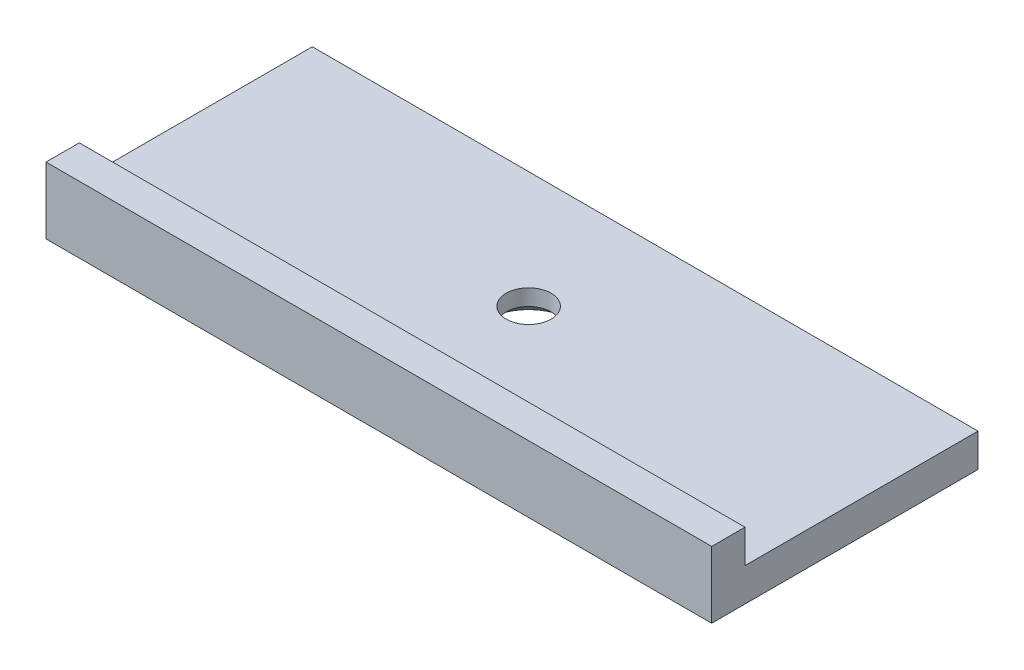
ISO-10303-21;
HEADER;
FILE_DESCRIPTION(('STEP AP214'),'2;1');
FILE_NAME('part.step','',(''),(''),'','','');
FILE_SCHEMA(('AUTOMOTIVE_DESIGN { 1 0 10303 214 1 1 1 1 }'));
ENDSEC;
DATA;
#1=APPLICATION_CONTEXT('core data for automotive mechanical design processes');
#2=APPLICATION_PROTOCOL_DEFINITION('international standard','automotive_design',2000,#1);
#3=PRODUCT_CONTEXT('',#1,'mechanical');
#4=PRODUCT('Part','Part','',(#3));
#5=PRODUCT_RELATED_PRODUCT_CATEGORY('part','',(#4));
#6=PRODUCT_DEFINITION_FORMATION('','',#4);
#7=PRODUCT_DEFINITION_CONTEXT('part definition',#1,'design');
#8=PRODUCT_DEFINITION('design','',#6,#7);
#9=PRODUCT_DEFINITION_SHAPE('','',#8);
#10=(LENGTH_UNIT() NAMED_UNIT(*) SI_UNIT(.MILLI.,.METRE.));
#11=(NAMED_UNIT(*) PLANE_ANGLE_UNIT() SI_UNIT($,.RADIAN.));
#12=(NAMED_UNIT(*) SI_UNIT($,.STERADIAN.) SOLID_ANGLE_UNIT());
#13=UNCERTAINTY_MEASURE_WITH_UNIT(LENGTH_MEASURE(1.E-05),#10,'distance_accuracy_value','');
#14=(GEOMETRIC_REPRESENTATION_CONTEXT(3) GLOBAL_UNCERTAINTY_ASSIGNED_CONTEXT((#13)) GLOBAL_UNIT_ASSIGNED_CONTEXT((#10,
#11,#12)) REPRESENTATION_CONTEXT('',''));
#15=CARTESIAN_POINT('',(0.,0.,0.));
#16=DIRECTION('',(0.,0.,1.));
#17=DIRECTION('',(1.,0.,0.));
#18=AXIS2_PLACEMENT_3D('',#15,#16,#17);
#19=CARTESIAN_POINT('',(50.,5.,17.5));
#20=DIRECTION('',(-1.,0.,0.));
#21=DIRECTION('',(0.,0.,1.));
#22=AXIS2_PLACEMENT_3D('',#19,#20,#21);
#23=PLANE('',#22);
#24=DIRECTION('',(0.,0.,-1.));
#25=VECTOR('',#24,1.);
#26=CARTESIAN_POINT('',(50.,0.,17.5));
#27=LINE('',#26,#25);
#28=CARTESIAN_POINT('',(50.,0.,22.5));
#29=VERTEX_POINT('',#28);
#30=CARTESIAN_POINT('',(50.,0.,-17.5));
#31=VERTEX_POINT('',#30);
#32=EDGE_CURVE('E100',#29,#31,#27,.T.);
#33=ORIENTED_EDGE('',*,*,#32,.T.);
#34=DIRECTION('',(0.,-1.,0.));
#35=VECTOR('',#34,1.);
#36=CARTESIAN_POINT('',(50.,5.,-17.5));
#37=LINE('',#36,#35);
#38=CARTESIAN_POINT('',(50.,5.,-17.5));
#39=VERTEX_POINT('',#38);
#40=EDGE_CURVE('E11',#39,#31,#37,.T.);
#41=ORIENTED_EDGE('',*,*,#40,.F.);
#42=DIRECTION('',(0.,0.,-1.));
#43=VECTOR('',#42,1.);
#44=CARTESIAN_POINT('',(50.,5.,17.5));
#45=LINE('',#44,#43);
#46=CARTESIAN_POINT('',(50.,5.,17.5));
#47=VERTEX_POINT('',#46);
#48=EDGE_CURVE('E92',#47,#39,#45,.T.);
#49=ORIENTED_EDGE('',*,*,#48,.F.);
#50=DIRECTION('',(0.,-1.,0.));
#51=VECTOR('',#50,1.);
#52=CARTESIAN_POINT('',(50.,10.,17.5));
#53=LINE('',#52,#51);
#54=CARTESIAN_POINT('',(50.,10.,17.5));
#55=VERTEX_POINT('',#54);
#56=EDGE_CURVE('E54',#55,#47,#53,.T.);
#57=ORIENTED_EDGE('',*,*,#56,.F.);
#58=DIRECTION('',(0.,0.,-1.));
#59=VECTOR('',#58,1.);
#60=CARTESIAN_POINT('',(50.,10.,17.5));
#61=LINE('',#60,#59);
#62=CARTESIAN_POINT('',(50.,10.,22.5));
#63=VERTEX_POINT('',#62);
#64=EDGE_CURVE('E127',#63,#55,#61,.T.);
#65=ORIENTED_EDGE('',*,*,#64,.F.);
#66=DIRECTION('',(0.,-1.,0.));
#67=VECTOR('',#66,1.);
#68=CARTESIAN_POINT('',(50.,10.,22.5));
#69=LINE('',#68,#67);
#70=EDGE_CURVE('E103',#63,#29,#69,.T.);
#71=ORIENTED_EDGE('',*,*,#70,.T.);
#72=EDGE_LOOP('',(#33,#41,#49,#57,#65,#71));
#73=FACE_BOUND('',#72,.T.);
#74=ADVANCED_FACE('F37',(#73),#23,.F.);
#75=CARTESIAN_POINT('',(-50.,5.,-17.5));
#76=DIRECTION('',(0.,0.,1.));
#77=DIRECTION('',(1.,0.,0.));
#78=AXIS2_PLACEMENT_3D('',#75,#76,#77);
#79=PLANE('',#78);
#80=DIRECTION('',(-1.,0.,0.));
#81=VECTOR('',#80,1.);
#82=CARTESIAN_POINT('',(-50.,0.,-17.5));
#83=LINE('',#82,#81);
#84=CARTESIAN_POINT('',(-50.,0.,-17.5));
#85=VERTEX_POINT('',#84);
#86=EDGE_CURVE('E67',#31,#85,#83,.T.);
#87=ORIENTED_EDGE('',*,*,#86,.T.);
#88=DIRECTION('',(0.,-1.,0.));
#89=VECTOR('',#88,1.);
#90=CARTESIAN_POINT('',(-50.,5.,-17.5));
#91=LINE('',#90,#89);
#92=CARTESIAN_POINT('',(-50.,5.,-17.5));
#93=VERTEX_POINT('',#92);
#94=EDGE_CURVE('E46',#93,#85,#91,.T.);
#95=ORIENTED_EDGE('',*,*,#94,.F.);
#96=DIRECTION('',(-1.,0.,0.));
#97=VECTOR('',#96,1.);
#98=CARTESIAN_POINT('',(-50.,5.,-17.5));
#99=LINE('',#98,#97);
#100=EDGE_CURVE('E82',#39,#93,#99,.T.);
#101=ORIENTED_EDGE('',*,*,#100,.F.);
#102=ORIENTED_EDGE('',*,*,#40,.T.);
#103=EDGE_LOOP('',(#87,#95,#101,#102));
#104=FACE_BOUND('',#103,.T.);
#105=ADVANCED_FACE('F84',(#104),#79,.F.);
#106=CARTESIAN_POINT('',(-50.,5.,17.5));
#107=DIRECTION('',(1.,0.,0.));
#108=DIRECTION('',(0.,0.,-1.));
#109=AXIS2_PLACEMENT_3D('',#106,#107,#108);
#110=PLANE('',#109);
#111=DIRECTION('',(0.,0.,1.));
#112=VECTOR('',#111,1.);
#113=CARTESIAN_POINT('',(-50.,0.,17.5));
#114=LINE('',#113,#112);
#115=CARTESIAN_POINT('',(-50.,0.,22.5));
#116=VERTEX_POINT('',#115);
#117=EDGE_CURVE('E97',#85,#116,#114,.T.);
#118=ORIENTED_EDGE('',*,*,#117,.T.);
#119=DIRECTION('',(0.,-1.,0.));
#120=VECTOR('',#119,1.);
#121=CARTESIAN_POINT('',(-50.,10.,22.5));
#122=LINE('',#121,#120);
#123=CARTESIAN_POINT('',(-50.,10.,22.5));
#124=VERTEX_POINT('',#123);
#125=EDGE_CURVE('E106',#124,#116,#122,.T.);
#126=ORIENTED_EDGE('',*,*,#125,.F.);
#127=DIRECTION('',(0.,0.,1.));
#128=VECTOR('',#127,1.);
#129=CARTESIAN_POINT('',(-50.,10.,17.5));
#130=LINE('',#129,#128);
#131=CARTESIAN_POINT('',(-50.,10.,17.5));
#132=VERTEX_POINT('',#131);
#133=EDGE_CURVE('E125',#132,#124,#130,.T.);
#134=ORIENTED_EDGE('',*,*,#133,.F.);
#135=DIRECTION('',(0.,-1.,0.));
#136=VECTOR('',#135,1.);
#137=CARTESIAN_POINT('',(-50.,10.,17.5));
#138=LINE('',#137,#136);
#139=CARTESIAN_POINT('',(-50.,5.,17.5));
#140=VERTEX_POINT('',#139);
#141=EDGE_CURVE('E120',#132,#140,#138,.T.);
#142=ORIENTED_EDGE('',*,*,#141,.T.);
#143=DIRECTION('',(0.,0.,1.));
#144=VECTOR('',#143,1.);
#145=CARTESIAN_POINT('',(-50.,5.,17.5));
#146=LINE('',#145,#144);
#147=EDGE_CURVE('E91',#93,#140,#146,.T.);
#148=ORIENTED_EDGE('',*,*,#147,.F.);
#149=ORIENTED_EDGE('',*,*,#94,.T.);
#150=EDGE_LOOP('',(#118,#126,#134,#142,#148,#149));
#151=FACE_BOUND('',#150,.T.);
#152=ADVANCED_FACE('F155',(#151),#110,.F.);
#153=CARTESIAN_POINT('',(0.,5.,0.));
#154=DIRECTION('',(0.,-1.,0.));
#155=DIRECTION('',(0.,0.,-1.));
#156=AXIS2_PLACEMENT_3D('',#153,#154,#155);
#157=PLANE('',#156);
#158=CARTESIAN_POINT('',(0.,5.,0.));
#159=DIRECTION('',(0.,-1.,0.));
#160=DIRECTION('',(0.,0.,-1.));
#161=AXIS2_PLACEMENT_3D('',#158,#159,#160);
#162=CIRCLE('',#161,3.3782);
#163=CARTESIAN_POINT('',(0.,5.,-3.3782));
#164=VERTEX_POINT('',#163);
#165=EDGE_CURVE('E40',#164,#164,#162,.T.);
#166=ORIENTED_EDGE('',*,*,#165,.T.);
#167=EDGE_LOOP('',(#166));
#168=FACE_BOUND('',#167,.T.);
#169=ORIENTED_EDGE('',*,*,#48,.T.);
#170=ORIENTED_EDGE('',*,*,#100,.T.);
#171=ORIENTED_EDGE('',*,*,#147,.T.);
#172=DIRECTION('',(1.,0.,0.));
#173=VECTOR('',#172,1.);
#174=CARTESIAN_POINT('',(-50.,5.,17.5));
#175=LINE('',#174,#173);
#176=EDGE_CURVE('E71',#140,#47,#175,.T.);
#177=ORIENTED_EDGE('',*,*,#176,.T.);
#178=EDGE_LOOP('',(#169,#170,#171,#177));
#179=FACE_BOUND('',#178,.T.);
#180=ADVANCED_FACE('F95',(#168,#179),#157,.F.);
#181=CARTESIAN_POINT('',(0.,0.,0.));
#182=DIRECTION('',(0.,-1.,0.));
#183=DIRECTION('',(0.,0.,-1.));
#184=AXIS2_PLACEMENT_3D('',#181,#182,#183);
#185=PLANE('',#184);
#186=CARTESIAN_POINT('',(0.,0.,0.));
#187=DIRECTION('',(0.,-1.,0.));
#188=DIRECTION('',(0.,0.,-1.));
#189=AXIS2_PLACEMENT_3D('',#186,#187,#188);
#190=CIRCLE('',#189,6.4389);
#191=CARTESIAN_POINT('',(0.,0.,-6.4389));
#192=VERTEX_POINT('',#191);
#193=EDGE_CURVE('E138',#192,#192,#190,.T.);
#194=ORIENTED_EDGE('',*,*,#193,.F.);
#195=EDGE_LOOP('',(#194));
#196=FACE_BOUND('',#195,.T.);
#197=ORIENTED_EDGE('',*,*,#32,.F.);
#198=DIRECTION('',(1.,0.,0.));
#199=VECTOR('',#198,1.);
#200=CARTESIAN_POINT('',(50.,0.,22.5));
#201=LINE('',#200,#199);
#202=EDGE_CURVE('E123',#116,#29,#201,.T.);
#203=ORIENTED_EDGE('',*,*,#202,.F.);
#204=ORIENTED_EDGE('',*,*,#117,.F.);
#205=ORIENTED_EDGE('',*,*,#86,.F.);
#206=EDGE_LOOP('',(#197,#203,#204,#205));
#207=FACE_BOUND('',#206,.T.);
#208=ADVANCED_FACE('F144',(#196,#207),#185,.T.);
#209=CARTESIAN_POINT('',(50.,10.,22.5));
#210=DIRECTION('',(0.,0.,-1.));
#211=DIRECTION('',(-1.,0.,0.));
#212=AXIS2_PLACEMENT_3D('',#209,#210,#211);
#213=PLANE('',#212);
#214=ORIENTED_EDGE('',*,*,#202,.T.);
#215=ORIENTED_EDGE('',*,*,#70,.F.);
#216=DIRECTION('',(1.,0.,0.));
#217=VECTOR('',#216,1.);
#218=CARTESIAN_POINT('',(50.,10.,22.5));
#219=LINE('',#218,#217);
#220=EDGE_CURVE('E130',#124,#63,#219,.T.);
#221=ORIENTED_EDGE('',*,*,#220,.F.);
#222=ORIENTED_EDGE('',*,*,#125,.T.);
#223=EDGE_LOOP('',(#214,#215,#221,#222));
#224=FACE_BOUND('',#223,.T.);
#225=ADVANCED_FACE('F146',(#224),#213,.F.);
#226=CARTESIAN_POINT('',(50.,10.,17.5));
#227=DIRECTION('',(0.,0.,1.));
#228=DIRECTION('',(1.,0.,0.));
#229=AXIS2_PLACEMENT_3D('',#226,#227,#228);
#230=PLANE('',#229);
#231=ORIENTED_EDGE('',*,*,#176,.F.);
#232=ORIENTED_EDGE('',*,*,#141,.F.);
#233=DIRECTION('',(-1.,0.,0.));
#234=VECTOR('',#233,1.);
#235=CARTESIAN_POINT('',(50.,10.,17.5));
#236=LINE('',#235,#234);
#237=EDGE_CURVE('E122',#55,#132,#236,.T.);
#238=ORIENTED_EDGE('',*,*,#237,.F.);
#239=ORIENTED_EDGE('',*,*,#56,.T.);
#240=EDGE_LOOP('',(#231,#232,#238,#239));
#241=FACE_BOUND('',#240,.T.);
#242=ADVANCED_FACE('F152',(#241),#230,.F.);
#243=CARTESIAN_POINT('',(0.,10.,0.));
#244=DIRECTION('',(0.,-1.,0.));
#245=DIRECTION('',(0.,0.,-1.));
#246=AXIS2_PLACEMENT_3D('',#243,#244,#245);
#247=PLANE('',#246);
#248=ORIENTED_EDGE('',*,*,#133,.T.);
#249=ORIENTED_EDGE('',*,*,#220,.T.);
#250=ORIENTED_EDGE('',*,*,#64,.T.);
#251=ORIENTED_EDGE('',*,*,#237,.T.);
#252=EDGE_LOOP('',(#248,#249,#250,#251));
#253=FACE_BOUND('',#252,.T.);
#254=ADVANCED_FACE('F176',(#253),#247,.F.);
#255=CARTESIAN_POINT('',(0.,0.,0.));
#256=DIRECTION('',(0.,-1.,0.));
#257=DIRECTION('',(0.,0.,-1.));
#258=AXIS2_PLACEMENT_3D('',#255,#256,#257);
#259=CYLINDRICAL_SURFACE('',#258,3.3782);
#260=CARTESIAN_POINT('',(0.,2.5682322411443,0.));
#261=DIRECTION('',(0.,-1.,0.));
#262=DIRECTION('',(0.,0.,-1.));
#263=AXIS2_PLACEMENT_3D('',#260,#261,#262);
#264=CIRCLE('',#263,3.3782);
#265=CARTESIAN_POINT('',(0.,2.5682322411443,-3.3782));
#266=VERTEX_POINT('',#265);
#267=EDGE_CURVE('E135',#266,#266,#264,.T.);
#268=ORIENTED_EDGE('',*,*,#267,.T.);
#269=EDGE_LOOP('',(#268));
#270=FACE_BOUND('',#269,.T.);
#271=ORIENTED_EDGE('',*,*,#165,.F.);
#272=EDGE_LOOP('',(#271));
#273=FACE_BOUND('',#272,.T.);
#274=ADVANCED_FACE('F184',(#270,#273),#259,.F.);
#275=CARTESIAN_POINT('',(0.,0.,0.));
#276=DIRECTION('',(0.,-1.,0.));
#277=DIRECTION('',(0.,0.,-1.));
#278=AXIS2_PLACEMENT_3D('',#275,#276,#277);
#279=CONICAL_SURFACE('',#278,6.4389,0.872664625997165);
#280=ORIENTED_EDGE('',*,*,#267,.F.);
#281=EDGE_LOOP('',(#280));
#282=FACE_BOUND('',#281,.T.);
#283=ORIENTED_EDGE('',*,*,#193,.T.);
#284=EDGE_LOOP('',(#283));
#285=FACE_BOUND('',#284,.T.);
#286=ADVANCED_FACE('F142',(#282,#285),#279,.F.);
#287=CLOSED_SHELL('',(#74,#105,#152,#180,#208,#225,#242,#254,#274,#286));
#288=MANIFOLD_SOLID_BREP('B2',#287);
#289=ADVANCED_BREP_SHAPE_REPRESENTATION('',(#18,#288),#14);
#290=SHAPE_DEFINITION_REPRESENTATION(#9,#289);
ENDSEC;
END-ISO-10303-21;
